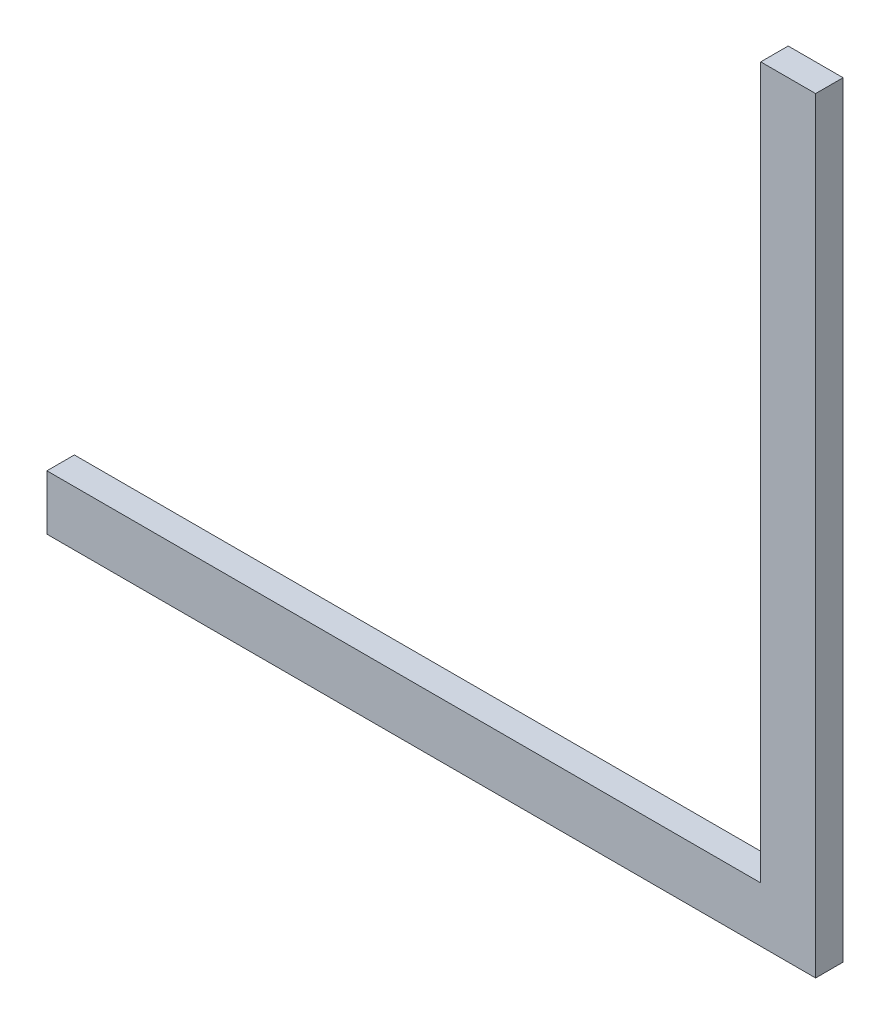
ISO-10303-21;
HEADER;
FILE_DESCRIPTION(('STEP AP214'),'2;1');
FILE_NAME('part.step','',(''),(''),'','','');
FILE_SCHEMA(('AUTOMOTIVE_DESIGN { 1 0 10303 214 1 1 1 1 }'));
ENDSEC;
DATA;
#1=APPLICATION_CONTEXT('core data for automotive mechanical design processes');
#2=APPLICATION_PROTOCOL_DEFINITION('international standard','automotive_design',2000,#1);
#3=PRODUCT_CONTEXT('',#1,'mechanical');
#4=PRODUCT('Part','Part','',(#3));
#5=PRODUCT_RELATED_PRODUCT_CATEGORY('part','',(#4));
#6=PRODUCT_DEFINITION_FORMATION('','',#4);
#7=PRODUCT_DEFINITION_CONTEXT('part definition',#1,'design');
#8=PRODUCT_DEFINITION('design','',#6,#7);
#9=PRODUCT_DEFINITION_SHAPE('','',#8);
#10=(LENGTH_UNIT() NAMED_UNIT(*) SI_UNIT(.MILLI.,.METRE.));
#11=(NAMED_UNIT(*) PLANE_ANGLE_UNIT() SI_UNIT($,.RADIAN.));
#12=(NAMED_UNIT(*) SI_UNIT($,.STERADIAN.) SOLID_ANGLE_UNIT());
#13=UNCERTAINTY_MEASURE_WITH_UNIT(LENGTH_MEASURE(1.E-05),#10,'distance_accuracy_value','');
#14=(GEOMETRIC_REPRESENTATION_CONTEXT(3) GLOBAL_UNCERTAINTY_ASSIGNED_CONTEXT((#13)) GLOBAL_UNIT_ASSIGNED_CONTEXT((#10,
#11,#12)) REPRESENTATION_CONTEXT('',''));
#15=CARTESIAN_POINT('',(0.,0.,0.));
#16=DIRECTION('',(0.,0.,1.));
#17=DIRECTION('',(1.,0.,0.));
#18=AXIS2_PLACEMENT_3D('',#15,#16,#17);
#19=CARTESIAN_POINT('',(0.,27.9,1.));
#20=DIRECTION('',(-1.,0.,0.));
#21=DIRECTION('',(0.,-1.,0.));
#22=AXIS2_PLACEMENT_3D('',#19,#20,#21);
#23=PLANE('',#22);
#24=DIRECTION('',(0.,1.,0.));
#25=VECTOR('',#24,1.);
#26=CARTESIAN_POINT('',(0.,27.9,0.));
#27=LINE('',#26,#25);
#28=CARTESIAN_POINT('',(0.,0.,0.));
#29=VERTEX_POINT('',#28);
#30=CARTESIAN_POINT('',(0.,27.9,0.));
#31=VERTEX_POINT('',#30);
#32=EDGE_CURVE('E82',#29,#31,#27,.T.);
#33=ORIENTED_EDGE('',*,*,#32,.T.);
#34=DIRECTION('',(0.,0.,-1.));
#35=VECTOR('',#34,1.);
#36=CARTESIAN_POINT('',(0.,27.9,1.));
#37=LINE('',#36,#35);
#38=CARTESIAN_POINT('',(0.,27.9,1.));
#39=VERTEX_POINT('',#38);
#40=EDGE_CURVE('E11',#39,#31,#37,.T.);
#41=ORIENTED_EDGE('',*,*,#40,.F.);
#42=DIRECTION('',(0.,1.,0.));
#43=VECTOR('',#42,1.);
#44=CARTESIAN_POINT('',(0.,25.9,1.));
#45=LINE('',#44,#43);
#46=CARTESIAN_POINT('',(0.,0.,1.));
#47=VERTEX_POINT('',#46);
#48=EDGE_CURVE('E87',#47,#39,#45,.T.);
#49=ORIENTED_EDGE('',*,*,#48,.F.);
#50=DIRECTION('',(0.,0.,-1.));
#51=VECTOR('',#50,1.);
#52=CARTESIAN_POINT('',(0.,0.,1.));
#53=LINE('',#52,#51);
#54=EDGE_CURVE('E118',#47,#29,#53,.T.);
#55=ORIENTED_EDGE('',*,*,#54,.T.);
#56=EDGE_LOOP('',(#33,#41,#49,#55));
#57=FACE_BOUND('',#56,.T.);
#58=ADVANCED_FACE('F39',(#57),#23,.F.);
#59=CARTESIAN_POINT('',(-2.,27.9,1.));
#60=DIRECTION('',(0.,-1.,0.));
#61=DIRECTION('',(0.,0.,-1.));
#62=AXIS2_PLACEMENT_3D('',#59,#60,#61);
#63=PLANE('',#62);
#64=DIRECTION('',(-1.,0.,0.));
#65=VECTOR('',#64,1.);
#66=CARTESIAN_POINT('',(-2.,27.9,0.));
#67=LINE('',#66,#65);
#68=CARTESIAN_POINT('',(-2.,27.9,0.));
#69=VERTEX_POINT('',#68);
#70=EDGE_CURVE('E123',#31,#69,#67,.T.);
#71=ORIENTED_EDGE('',*,*,#70,.T.);
#72=DIRECTION('',(0.,0.,-1.));
#73=VECTOR('',#72,1.);
#74=CARTESIAN_POINT('',(-2.,27.9,1.));
#75=LINE('',#74,#73);
#76=CARTESIAN_POINT('',(-2.,27.9,1.));
#77=VERTEX_POINT('',#76);
#78=EDGE_CURVE('E47',#77,#69,#75,.T.);
#79=ORIENTED_EDGE('',*,*,#78,.F.);
#80=DIRECTION('',(-1.,0.,0.));
#81=VECTOR('',#80,1.);
#82=CARTESIAN_POINT('',(-2.,27.9,1.));
#83=LINE('',#82,#81);
#84=EDGE_CURVE('E143',#39,#77,#83,.T.);
#85=ORIENTED_EDGE('',*,*,#84,.F.);
#86=ORIENTED_EDGE('',*,*,#40,.T.);
#87=EDGE_LOOP('',(#71,#79,#85,#86));
#88=FACE_BOUND('',#87,.T.);
#89=ADVANCED_FACE('F142',(#88),#63,.F.);
#90=CARTESIAN_POINT('',(-2.,2.,1.));
#91=DIRECTION('',(1.,0.,0.));
#92=DIRECTION('',(0.,0.,-1.));
#93=AXIS2_PLACEMENT_3D('',#90,#91,#92);
#94=PLANE('',#93);
#95=DIRECTION('',(0.,-1.,0.));
#96=VECTOR('',#95,1.);
#97=CARTESIAN_POINT('',(-2.,2.,0.));
#98=LINE('',#97,#96);
#99=CARTESIAN_POINT('',(-2.,2.,0.));
#100=VERTEX_POINT('',#99);
#101=EDGE_CURVE('E126',#69,#100,#98,.T.);
#102=ORIENTED_EDGE('',*,*,#101,.T.);
#103=DIRECTION('',(0.,0.,-1.));
#104=VECTOR('',#103,1.);
#105=CARTESIAN_POINT('',(-2.,2.,1.));
#106=LINE('',#105,#104);
#107=CARTESIAN_POINT('',(-2.,2.,1.));
#108=VERTEX_POINT('',#107);
#109=EDGE_CURVE('E112',#108,#100,#106,.T.);
#110=ORIENTED_EDGE('',*,*,#109,.F.);
#111=DIRECTION('',(0.,-1.,0.));
#112=VECTOR('',#111,1.);
#113=CARTESIAN_POINT('',(-2.,25.9,1.));
#114=LINE('',#113,#112);
#115=EDGE_CURVE('E102',#77,#108,#114,.T.);
#116=ORIENTED_EDGE('',*,*,#115,.F.);
#117=ORIENTED_EDGE('',*,*,#78,.T.);
#118=EDGE_LOOP('',(#102,#110,#116,#117));
#119=FACE_BOUND('',#118,.T.);
#120=ADVANCED_FACE('F139',(#119),#94,.F.);
#121=CARTESIAN_POINT('',(-28.,2.,1.));
#122=DIRECTION('',(0.,-1.,0.));
#123=DIRECTION('',(1.,0.,0.));
#124=AXIS2_PLACEMENT_3D('',#121,#122,#123);
#125=PLANE('',#124);
#126=DIRECTION('',(-1.,0.,0.));
#127=VECTOR('',#126,1.);
#128=CARTESIAN_POINT('',(-28.,2.,0.));
#129=LINE('',#128,#127);
#130=CARTESIAN_POINT('',(-28.,2.,0.));
#131=VERTEX_POINT('',#130);
#132=EDGE_CURVE('E110',#100,#131,#129,.T.);
#133=ORIENTED_EDGE('',*,*,#132,.T.);
#134=DIRECTION('',(0.,0.,-1.));
#135=VECTOR('',#134,1.);
#136=CARTESIAN_POINT('',(-28.,2.,1.));
#137=LINE('',#136,#135);
#138=CARTESIAN_POINT('',(-28.,2.,1.));
#139=VERTEX_POINT('',#138);
#140=EDGE_CURVE('E108',#139,#131,#137,.T.);
#141=ORIENTED_EDGE('',*,*,#140,.F.);
#142=DIRECTION('',(-1.,0.,0.));
#143=VECTOR('',#142,1.);
#144=CARTESIAN_POINT('',(-26.,2.,1.));
#145=LINE('',#144,#143);
#146=EDGE_CURVE('E95',#108,#139,#145,.T.);
#147=ORIENTED_EDGE('',*,*,#146,.F.);
#148=ORIENTED_EDGE('',*,*,#109,.T.);
#149=EDGE_LOOP('',(#133,#141,#147,#148));
#150=FACE_BOUND('',#149,.T.);
#151=ADVANCED_FACE('F109',(#150),#125,.F.);
#152=CARTESIAN_POINT('',(-28.,0.,1.));
#153=DIRECTION('',(1.,0.,0.));
#154=DIRECTION('',(0.,0.,-1.));
#155=AXIS2_PLACEMENT_3D('',#152,#153,#154);
#156=PLANE('',#155);
#157=DIRECTION('',(0.,-1.,0.));
#158=VECTOR('',#157,1.);
#159=CARTESIAN_POINT('',(-28.,0.,0.));
#160=LINE('',#159,#158);
#161=CARTESIAN_POINT('',(-28.,0.,0.));
#162=VERTEX_POINT('',#161);
#163=EDGE_CURVE('E130',#131,#162,#160,.T.);
#164=ORIENTED_EDGE('',*,*,#163,.T.);
#165=DIRECTION('',(0.,0.,-1.));
#166=VECTOR('',#165,1.);
#167=CARTESIAN_POINT('',(-28.,0.,1.));
#168=LINE('',#167,#166);
#169=CARTESIAN_POINT('',(-28.,0.,1.));
#170=VERTEX_POINT('',#169);
#171=EDGE_CURVE('E113',#170,#162,#168,.T.);
#172=ORIENTED_EDGE('',*,*,#171,.F.);
#173=DIRECTION('',(0.,-1.,0.));
#174=VECTOR('',#173,1.);
#175=CARTESIAN_POINT('',(-28.,0.,1.));
#176=LINE('',#175,#174);
#177=EDGE_CURVE('E99',#139,#170,#176,.T.);
#178=ORIENTED_EDGE('',*,*,#177,.F.);
#179=ORIENTED_EDGE('',*,*,#140,.T.);
#180=EDGE_LOOP('',(#164,#172,#178,#179));
#181=FACE_BOUND('',#180,.T.);
#182=ADVANCED_FACE('F115',(#181),#156,.F.);
#183=CARTESIAN_POINT('',(0.,0.,1.));
#184=DIRECTION('',(0.,1.,0.));
#185=DIRECTION('',(0.,0.,1.));
#186=AXIS2_PLACEMENT_3D('',#183,#184,#185);
#187=PLANE('',#186);
#188=DIRECTION('',(1.,0.,0.));
#189=VECTOR('',#188,1.);
#190=CARTESIAN_POINT('',(0.,0.,0.));
#191=LINE('',#190,#189);
#192=EDGE_CURVE('E78',#162,#29,#191,.T.);
#193=ORIENTED_EDGE('',*,*,#192,.T.);
#194=ORIENTED_EDGE('',*,*,#54,.F.);
#195=DIRECTION('',(1.,0.,0.));
#196=VECTOR('',#195,1.);
#197=CARTESIAN_POINT('',(-26.,0.,1.));
#198=LINE('',#197,#196);
#199=EDGE_CURVE('E55',#170,#47,#198,.T.);
#200=ORIENTED_EDGE('',*,*,#199,.F.);
#201=ORIENTED_EDGE('',*,*,#171,.T.);
#202=EDGE_LOOP('',(#193,#194,#200,#201));
#203=FACE_BOUND('',#202,.T.);
#204=ADVANCED_FACE('F146',(#203),#187,.F.);
#205=CARTESIAN_POINT('',(0.,0.,1.));
#206=DIRECTION('',(0.,0.,-1.));
#207=DIRECTION('',(-1.,0.,0.));
#208=AXIS2_PLACEMENT_3D('',#205,#206,#207);
#209=PLANE('',#208);
#210=ORIENTED_EDGE('',*,*,#48,.T.);
#211=ORIENTED_EDGE('',*,*,#84,.T.);
#212=ORIENTED_EDGE('',*,*,#115,.T.);
#213=ORIENTED_EDGE('',*,*,#146,.T.);
#214=ORIENTED_EDGE('',*,*,#177,.T.);
#215=ORIENTED_EDGE('',*,*,#199,.T.);
#216=EDGE_LOOP('',(#210,#211,#212,#213,#214,#215));
#217=FACE_BOUND('',#216,.T.);
#218=ADVANCED_FACE('F97',(#217),#209,.F.);
#219=CARTESIAN_POINT('',(0.,0.,0.));
#220=DIRECTION('',(0.,0.,-1.));
#221=DIRECTION('',(-1.,0.,0.));
#222=AXIS2_PLACEMENT_3D('',#219,#220,#221);
#223=PLANE('',#222);
#224=ORIENTED_EDGE('',*,*,#32,.F.);
#225=ORIENTED_EDGE('',*,*,#192,.F.);
#226=ORIENTED_EDGE('',*,*,#163,.F.);
#227=ORIENTED_EDGE('',*,*,#132,.F.);
#228=ORIENTED_EDGE('',*,*,#101,.F.);
#229=ORIENTED_EDGE('',*,*,#70,.F.);
#230=EDGE_LOOP('',(#224,#225,#226,#227,#228,#229));
#231=FACE_BOUND('',#230,.T.);
#232=ADVANCED_FACE('F144',(#231),#223,.T.);
#233=CLOSED_SHELL('',(#58,#89,#120,#151,#182,#204,#218,#232));
#234=MANIFOLD_SOLID_BREP('B2',#233);
#235=ADVANCED_BREP_SHAPE_REPRESENTATION('',(#18,#234),#14);
#236=SHAPE_DEFINITION_REPRESENTATION(#9,#235);
ENDSEC;
END-ISO-10303-21;
